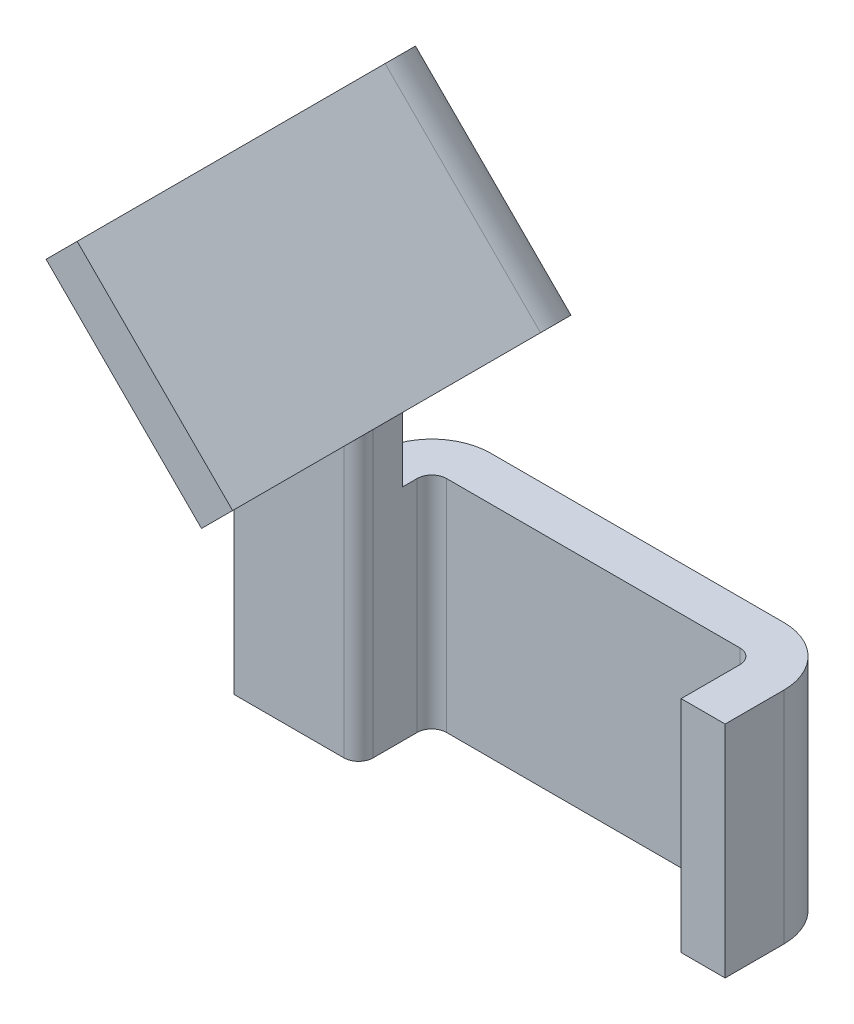
ISO-10303-21;
HEADER;
FILE_DESCRIPTION(('STEP AP214'),'2;1');
FILE_NAME('part.step','',(''),(''),'','','');
FILE_SCHEMA(('AUTOMOTIVE_DESIGN { 1 0 10303 214 1 1 1 1 }'));
ENDSEC;
DATA;
#1=APPLICATION_CONTEXT('core data for automotive mechanical design processes');
#2=APPLICATION_PROTOCOL_DEFINITION('international standard','automotive_design',2000,#1);
#3=PRODUCT_CONTEXT('',#1,'mechanical');
#4=PRODUCT('Part','Part','',(#3));
#5=PRODUCT_RELATED_PRODUCT_CATEGORY('part','',(#4));
#6=PRODUCT_DEFINITION_FORMATION('','',#4);
#7=PRODUCT_DEFINITION_CONTEXT('part definition',#1,'design');
#8=PRODUCT_DEFINITION('design','',#6,#7);
#9=PRODUCT_DEFINITION_SHAPE('','',#8);
#10=(LENGTH_UNIT() NAMED_UNIT(*) SI_UNIT(.MILLI.,.METRE.));
#11=(NAMED_UNIT(*) PLANE_ANGLE_UNIT() SI_UNIT($,.RADIAN.));
#12=(NAMED_UNIT(*) SI_UNIT($,.STERADIAN.) SOLID_ANGLE_UNIT());
#13=UNCERTAINTY_MEASURE_WITH_UNIT(LENGTH_MEASURE(1.E-05),#10,'distance_accuracy_value','');
#14=(GEOMETRIC_REPRESENTATION_CONTEXT(3) GLOBAL_UNCERTAINTY_ASSIGNED_CONTEXT((#13)) GLOBAL_UNIT_ASSIGNED_CONTEXT((#10,
#11,#12)) REPRESENTATION_CONTEXT('',''));
#15=CARTESIAN_POINT('',(0.,0.,0.));
#16=DIRECTION('',(0.,0.,1.));
#17=DIRECTION('',(1.,0.,0.));
#18=AXIS2_PLACEMENT_3D('',#15,#16,#17);
#19=CARTESIAN_POINT('',(-6.199999999999,13.5,2.));
#20=DIRECTION('',(0.,0.,-1.));
#21=DIRECTION('',(0.,-1.,0.));
#22=AXIS2_PLACEMENT_3D('',#19,#20,#21);
#23=PLANE('',#22);
#24=DIRECTION('',(1.,0.,0.));
#25=VECTOR('',#24,1.);
#26=CARTESIAN_POINT('',(-8.600000000009,12.00000000001,2.00000000001));
#27=LINE('',#26,#25);
#28=CARTESIAN_POINT('',(-8.599999999999,12.,2.));
#29=VERTEX_POINT('',#28);
#30=CARTESIAN_POINT('',(-6.599999999999,12.,2.));
#31=VERTEX_POINT('',#30);
#32=EDGE_CURVE('E258',#29,#31,#27,.T.);
#33=ORIENTED_EDGE('',*,*,#32,.T.);
#34=DIRECTION('',(0.,-1.,0.));
#35=VECTOR('',#34,1.);
#36=CARTESIAN_POINT('',(-6.600000000009,13.50000000001,2.00000000001));
#37=LINE('',#36,#35);
#38=CARTESIAN_POINT('',(-6.599999999999,13.5,2.));
#39=VERTEX_POINT('',#38);
#40=EDGE_CURVE('E784',#39,#31,#37,.T.);
#41=ORIENTED_EDGE('',*,*,#40,.F.);
#42=DIRECTION('',(-1.,0.,0.));
#43=VECTOR('',#42,1.);
#44=CARTESIAN_POINT('',(-6.600000000009,13.50000000001,2.00000000001));
#45=LINE('',#44,#43);
#46=CARTESIAN_POINT('',(-8.599999999999,13.5,2.));
#47=VERTEX_POINT('',#46);
#48=EDGE_CURVE('E827',#39,#47,#45,.T.);
#49=ORIENTED_EDGE('',*,*,#48,.T.);
#50=DIRECTION('',(0.,1.,0.));
#51=VECTOR('',#50,1.);
#52=CARTESIAN_POINT('',(-8.600000000009,12.00000000001,2.00000000001));
#53=LINE('',#52,#51);
#54=EDGE_CURVE('E11',#29,#47,#53,.T.);
#55=ORIENTED_EDGE('',*,*,#54,.F.);
#56=EDGE_LOOP('',(#33,#41,#49,#55));
#57=FACE_BOUND('',#56,.T.);
#58=ADVANCED_FACE('F17',(#57),#23,.F.);
#59=CARTESIAN_POINT('',(-8.599999999999,13.5,2.1));
#60=DIRECTION('',(0.,1.,0.));
#61=DIRECTION('',(0.,0.,1.));
#62=AXIS2_PLACEMENT_3D('',#59,#60,#61);
#63=CYLINDRICAL_SURFACE('',#62,0.1);
#64=ORIENTED_EDGE('',*,*,#54,.T.);
#65=CARTESIAN_POINT('',(-8.600000000009,13.50000000001,2.10000000001));
#66=DIRECTION('',(0.,-1.,0.));
#67=DIRECTION('',(-1.,0.,0.));
#68=AXIS2_PLACEMENT_3D('',#65,#66,#67);
#69=CIRCLE('',#68,0.10000000001);
#70=CARTESIAN_POINT('',(-8.699999999999,13.5,2.1));
#71=VERTEX_POINT('',#70);
#72=EDGE_CURVE('E830',#71,#47,#69,.T.);
#73=ORIENTED_EDGE('',*,*,#72,.F.);
#74=DIRECTION('',(0.,-1.,0.));
#75=VECTOR('',#74,1.);
#76=CARTESIAN_POINT('',(-8.700000000009,13.50000000001,2.10000000001));
#77=LINE('',#76,#75);
#78=CARTESIAN_POINT('',(-8.699999999999,12.,2.1));
#79=VERTEX_POINT('',#78);
#80=EDGE_CURVE('E386',#71,#79,#77,.T.);
#81=ORIENTED_EDGE('',*,*,#80,.T.);
#82=CARTESIAN_POINT('',(-8.600000000009,12.00000000001,2.10000000001));
#83=DIRECTION('',(0.,1.,0.));
#84=DIRECTION('',(0.,0.,-1.));
#85=AXIS2_PLACEMENT_3D('',#82,#83,#84);
#86=CIRCLE('',#85,0.10000000001);
#87=EDGE_CURVE('E261',#29,#79,#86,.T.);
#88=ORIENTED_EDGE('',*,*,#87,.F.);
#89=EDGE_LOOP('',(#64,#73,#81,#88));
#90=FACE_BOUND('',#89,.T.);
#91=ADVANCED_FACE('F677',(#90),#63,.F.);
#92=CARTESIAN_POINT('',(-8.701471862575,16.05852813742,2.6));
#93=DIRECTION('',(-0.707106781186548,0.707106781186548,0.));
#94=DIRECTION('',(0.707106781186548,0.707106781186548,0.));
#95=AXIS2_PLACEMENT_3D('',#92,#93,#94);
#96=CYLINDRICAL_SURFACE('',#95,0.4);
#97=DIRECTION('',(0.707106781186548,-0.707106781186548,0.));
#98=VECTOR('',#97,1.);
#99=CARTESIAN_POINT('',(-8.701471862585,16.05852813743,2.20000000001));
#100=LINE('',#99,#98);
#101=CARTESIAN_POINT('',(-8.701471862575,16.05852813742,2.2));
#102=VERTEX_POINT('',#101);
#103=CARTESIAN_POINT('',(-7.641471862576,14.99852813742,2.2));
#104=VERTEX_POINT('',#103);
#105=EDGE_CURVE('E826',#102,#104,#100,.T.);
#106=ORIENTED_EDGE('',*,*,#105,.F.);
#107=CARTESIAN_POINT('',(-8.701471862585,16.05852813743,2.60000000001));
#108=DIRECTION('',(-0.707106781186548,0.707106781186548,0.));
#109=DIRECTION('',(0.707106781186548,0.707106781186548,-4.71511697856544E-11));
#110=AXIS2_PLACEMENT_3D('',#107,#108,#109);
#111=CIRCLE('',#110,0.400000000014142);
#112=CARTESIAN_POINT('',(-8.418629150101,16.3413708499,2.599999999997));
#113=VERTEX_POINT('',#112);
#114=EDGE_CURVE('E327',#113,#102,#111,.T.);
#115=ORIENTED_EDGE('',*,*,#114,.F.);
#116=DIRECTION('',(0.707106781186598,-0.707106781186498,7.43364663020343E-12));
#117=VECTOR('',#116,1.);
#118=CARTESIAN_POINT('',(-8.418629150111,16.34137084991,2.600000000007));
#119=LINE('',#118,#117);
#120=CARTESIAN_POINT('',(-7.358629150101,15.2813708499,2.599999999998));
#121=VERTEX_POINT('',#120);
#122=EDGE_CURVE('E26',#113,#121,#119,.T.);
#123=ORIENTED_EDGE('',*,*,#122,.T.);
#124=CARTESIAN_POINT('',(-7.641471862586,14.99852813743,2.60000000001));
#125=DIRECTION('',(0.707106781186548,-0.707106781186548,0.));
#126=DIRECTION('',(-2.50244249059162E-11,-2.5022204459867E-11,-1.));
#127=AXIS2_PLACEMENT_3D('',#124,#125,#126);
#128=CIRCLE('',#127,0.40000000001);
#129=EDGE_CURVE('E301',#104,#121,#128,.T.);
#130=ORIENTED_EDGE('',*,*,#129,.F.);
#131=EDGE_LOOP('',(#106,#115,#123,#130));
#132=FACE_BOUND('',#131,.T.);
#133=ADVANCED_FACE('F666',(#132),#96,.T.);
#134=CARTESIAN_POINT('',(-8.418629150101,16.3413708499,4.7));
#135=DIRECTION('',(0.707106781186548,0.707106781186548,0.));
#136=DIRECTION('',(0.,0.,-1.));
#137=AXIS2_PLACEMENT_3D('',#134,#135,#136);
#138=PLANE('',#137);
#139=DIRECTION('',(-0.707106781186598,0.707106781186498,0.));
#140=VECTOR('',#139,1.);
#141=CARTESIAN_POINT('',(-7.358629150111,15.28137084991,4.70000000001));
#142=LINE('',#141,#140);
#143=CARTESIAN_POINT('',(-7.358629150101,15.2813708499,4.7));
#144=VERTEX_POINT('',#143);
#145=CARTESIAN_POINT('',(-8.418629150101,16.3413708499,4.7));
#146=VERTEX_POINT('',#145);
#147=EDGE_CURVE('E337',#144,#146,#142,.T.);
#148=ORIENTED_EDGE('',*,*,#147,.F.);
#149=DIRECTION('',(4.8566437933117E-12,4.86256498277637E-12,-1.));
#150=VECTOR('',#149,1.);
#151=CARTESIAN_POINT('',(-7.358629150111,15.28137084991,4.70000000001));
#152=LINE('',#151,#150);
#153=EDGE_CURVE('E305',#144,#121,#152,.T.);
#154=ORIENTED_EDGE('',*,*,#153,.T.);
#155=ORIENTED_EDGE('',*,*,#122,.F.);
#156=DIRECTION('',(4.86087321435554E-12,4.86002733014631E-12,-1.));
#157=VECTOR('',#156,1.);
#158=CARTESIAN_POINT('',(-8.418629150111,16.34137084991,4.70000000001));
#159=LINE('',#158,#157);
#160=EDGE_CURVE('E323',#146,#113,#159,.T.);
#161=ORIENTED_EDGE('',*,*,#160,.F.);
#162=EDGE_LOOP('',(#148,#154,#155,#161));
#163=FACE_BOUND('',#162,.T.);
#164=ADVANCED_FACE('F655',(#163),#138,.T.);
#165=CARTESIAN_POINT('',(-7.570761184456,15.06923881554,4.7));
#166=DIRECTION('',(0.,0.,-1.));
#167=DIRECTION('',(0.,-1.,0.));
#168=AXIS2_PLACEMENT_3D('',#165,#166,#167);
#169=PLANE('',#168);
#170=ORIENTED_EDGE('',*,*,#147,.T.);
#171=DIRECTION('',(-0.707106781186498,-0.707106781186598,0.));
#172=VECTOR('',#171,1.);
#173=CARTESIAN_POINT('',(-8.418629150111,16.34137084991,4.70000000001));
#174=LINE('',#173,#172);
#175=CARTESIAN_POINT('',(-8.630761184457,16.12923881554,4.7));
#176=VERTEX_POINT('',#175);
#177=EDGE_CURVE('E281',#146,#176,#174,.T.);
#178=ORIENTED_EDGE('',*,*,#177,.T.);
#179=DIRECTION('',(0.707106781186698,-0.707106781186398,0.));
#180=VECTOR('',#179,1.);
#181=CARTESIAN_POINT('',(-8.630761184467,16.12923881555,4.70000000001));
#182=LINE('',#181,#180);
#183=CARTESIAN_POINT('',(-7.570761184457,15.06923881554,4.7));
#184=VERTEX_POINT('',#183);
#185=EDGE_CURVE('E340',#176,#184,#182,.T.);
#186=ORIENTED_EDGE('',*,*,#185,.T.);
#187=DIRECTION('',(0.707106781186248,0.707106781186848,0.));
#188=VECTOR('',#187,1.);
#189=CARTESIAN_POINT('',(-7.570761184467,15.06923881555,4.70000000001));
#190=LINE('',#189,#188);
#191=EDGE_CURVE('E307',#184,#144,#190,.T.);
#192=ORIENTED_EDGE('',*,*,#191,.T.);
#193=EDGE_LOOP('',(#170,#178,#186,#192));
#194=FACE_BOUND('',#193,.T.);
#195=ADVANCED_FACE('F645',(#194),#169,.F.);
#196=CARTESIAN_POINT('',(-8.701471862575,16.05852813742,2.6));
#197=DIRECTION('',(-0.707106781186548,0.707106781186548,0.));
#198=DIRECTION('',(0.707106781186548,0.707106781186548,0.));
#199=AXIS2_PLACEMENT_3D('',#196,#197,#198);
#200=CYLINDRICAL_SURFACE('',#199,0.1);
#201=DIRECTION('',(-0.707106781186548,0.707106781186548,0.));
#202=VECTOR('',#201,1.);
#203=CARTESIAN_POINT('',(-7.641471862585,14.99852813743,2.50000000001));
#204=LINE('',#203,#202);
#205=CARTESIAN_POINT('',(-7.641471862575,14.99852813742,2.5));
#206=VERTEX_POINT('',#205);
#207=CARTESIAN_POINT('',(-8.701471862575,16.05852813742,2.5));
#208=VERTEX_POINT('',#207);
#209=EDGE_CURVE('E282',#206,#208,#204,.T.);
#210=ORIENTED_EDGE('',*,*,#209,.F.);
#211=CARTESIAN_POINT('',(-7.641471862585,14.99852813743,2.60000000001));
#212=DIRECTION('',(-0.707106781186548,0.707106781186548,0.));
#213=DIRECTION('',(0.707106781186548,0.707106781186548,1.37019276513725E-10));
#214=AXIS2_PLACEMENT_3D('',#211,#212,#213);
#215=CIRCLE('',#214,0.100000000014142);
#216=CARTESIAN_POINT('',(-7.570761184457,15.06923881554,2.600000000001));
#217=VERTEX_POINT('',#216);
#218=EDGE_CURVE('E315',#217,#206,#215,.T.);
#219=ORIENTED_EDGE('',*,*,#218,.F.);
#220=DIRECTION('',(-0.707106781186698,0.707106781186398,-7.8599415449251E-12));
#221=VECTOR('',#220,1.);
#222=CARTESIAN_POINT('',(-7.570761184467,15.06923881555,2.600000000011));
#223=LINE('',#222,#221);
#224=CARTESIAN_POINT('',(-8.630761184457,16.12923881554,2.599999999999));
#225=VERTEX_POINT('',#224);
#226=EDGE_CURVE('E39',#217,#225,#223,.T.);
#227=ORIENTED_EDGE('',*,*,#226,.T.);
#228=CARTESIAN_POINT('',(-8.701471862585,16.05852813743,2.60000000001));
#229=DIRECTION('',(0.707106781186548,-0.707106781186548,0.));
#230=DIRECTION('',(0.,0.,-1.));
#231=AXIS2_PLACEMENT_3D('',#228,#229,#230);
#232=CIRCLE('',#231,0.10000000001);
#233=EDGE_CURVE('E330',#208,#225,#232,.T.);
#234=ORIENTED_EDGE('',*,*,#233,.F.);
#235=EDGE_LOOP('',(#210,#219,#227,#234));
#236=FACE_BOUND('',#235,.T.);
#237=ADVANCED_FACE('F634',(#236),#200,.F.);
#238=CARTESIAN_POINT('',(-7.586990009292,15.08546764038,4.7));
#239=DIRECTION('',(0.707106781186548,0.707106781186548,0.));
#240=DIRECTION('',(0.,0.,-1.));
#241=AXIS2_PLACEMENT_3D('',#238,#239,#240);
#242=PLANE('',#241);
#243=DIRECTION('',(-4.78855011447525E-12,-4.78389775132446E-12,1.));
#244=VECTOR('',#243,1.);
#245=CARTESIAN_POINT('',(-7.570761184467,15.06923881555,2.600000000011));
#246=LINE('',#245,#244);
#247=EDGE_CURVE('E311',#217,#184,#246,.T.);
#248=ORIENTED_EDGE('',*,*,#247,.T.);
#249=ORIENTED_EDGE('',*,*,#185,.F.);
#250=DIRECTION('',(4.78728128815684E-12,4.78728128815684E-12,-1.));
#251=VECTOR('',#250,1.);
#252=CARTESIAN_POINT('',(-8.630761184467,16.12923881555,4.70000000001));
#253=LINE('',#252,#251);
#254=EDGE_CURVE('E334',#176,#225,#253,.T.);
#255=ORIENTED_EDGE('',*,*,#254,.T.);
#256=ORIENTED_EDGE('',*,*,#226,.F.);
#257=EDGE_LOOP('',(#248,#249,#255,#256));
#258=FACE_BOUND('',#257,.T.);
#259=ADVANCED_FACE('F623',(#258),#242,.F.);
#260=CARTESIAN_POINT('',(-9.549999999999,15.21,2.2));
#261=DIRECTION('',(-0.707106781186548,0.707106781186548,0.));
#262=DIRECTION('',(0.,0.,1.));
#263=AXIS2_PLACEMENT_3D('',#260,#261,#262);
#264=PLANE('',#263);
#265=ORIENTED_EDGE('',*,*,#177,.F.);
#266=ORIENTED_EDGE('',*,*,#160,.T.);
#267=ORIENTED_EDGE('',*,*,#114,.T.);
#268=DIRECTION('',(0.707106781186548,0.707106781186548,0.));
#269=VECTOR('',#268,1.);
#270=CARTESIAN_POINT('',(-9.550000000009,15.21000000001,2.20000000001));
#271=LINE('',#270,#269);
#272=CARTESIAN_POINT('',(-9.549999999999,15.21,2.2));
#273=VERTEX_POINT('',#272);
#274=EDGE_CURVE('E294',#273,#102,#271,.T.);
#275=ORIENTED_EDGE('',*,*,#274,.F.);
#276=DIRECTION('',(0.,0.,-1.));
#277=VECTOR('',#276,1.);
#278=CARTESIAN_POINT('',(-9.550000000009,15.21000000001,2.50000000001));
#279=LINE('',#278,#277);
#280=CARTESIAN_POINT('',(-9.549999999999,15.21,2.5));
#281=VERTEX_POINT('',#280);
#282=EDGE_CURVE('E286',#281,#273,#279,.T.);
#283=ORIENTED_EDGE('',*,*,#282,.F.);
#284=DIRECTION('',(-0.707106781186548,-0.707106781186548,0.));
#285=VECTOR('',#284,1.);
#286=CARTESIAN_POINT('',(-8.701471862585,16.05852813743,2.50000000001));
#287=LINE('',#286,#285);
#288=EDGE_CURVE('E278',#208,#281,#287,.T.);
#289=ORIENTED_EDGE('',*,*,#288,.F.);
#290=ORIENTED_EDGE('',*,*,#233,.T.);
#291=ORIENTED_EDGE('',*,*,#254,.F.);
#292=EDGE_LOOP('',(#265,#266,#267,#275,#283,#289,#290,#291));
#293=FACE_BOUND('',#292,.T.);
#294=ADVANCED_FACE('F613',(#293),#264,.T.);
#295=CARTESIAN_POINT('',(-8.630761184456,16.12923881554,2.5));
#296=DIRECTION('',(0.,0.,-1.));
#297=DIRECTION('',(0.,-1.,0.));
#298=AXIS2_PLACEMENT_3D('',#295,#296,#297);
#299=PLANE('',#298);
#300=DIRECTION('',(0.707106781186548,0.707106781186548,0.));
#301=VECTOR('',#300,1.);
#302=CARTESIAN_POINT('',(-8.800000000009,13.84000000001,2.50000000001));
#303=LINE('',#302,#301);
#304=CARTESIAN_POINT('',(-8.799999999999,13.84,2.5));
#305=VERTEX_POINT('',#304);
#306=EDGE_CURVE('E319',#305,#206,#303,.T.);
#307=ORIENTED_EDGE('',*,*,#306,.T.);
#308=ORIENTED_EDGE('',*,*,#209,.T.);
#309=ORIENTED_EDGE('',*,*,#288,.T.);
#310=DIRECTION('',(0.,-1.,0.));
#311=VECTOR('',#310,1.);
#312=CARTESIAN_POINT('',(-9.550000000009,15.21000000001,2.50000000001));
#313=LINE('',#312,#311);
#314=CARTESIAN_POINT('',(-9.549999999999,12.,2.5));
#315=VERTEX_POINT('',#314);
#316=EDGE_CURVE('E283',#281,#315,#313,.T.);
#317=ORIENTED_EDGE('',*,*,#316,.T.);
#318=DIRECTION('',(1.,0.,0.));
#319=VECTOR('',#318,1.);
#320=CARTESIAN_POINT('',(-9.550000000009,12.00000000001,2.50000000001));
#321=LINE('',#320,#319);
#322=CARTESIAN_POINT('',(-8.799999999999,12.,2.5));
#323=VERTEX_POINT('',#322);
#324=EDGE_CURVE('E273',#315,#323,#321,.T.);
#325=ORIENTED_EDGE('',*,*,#324,.T.);
#326=DIRECTION('',(0.,-1.,0.));
#327=VECTOR('',#326,1.);
#328=CARTESIAN_POINT('',(-8.800000000009,13.84000000001,2.50000000001));
#329=LINE('',#328,#327);
#330=EDGE_CURVE('E394',#305,#323,#329,.T.);
#331=ORIENTED_EDGE('',*,*,#330,.F.);
#332=EDGE_LOOP('',(#307,#308,#309,#317,#325,#331));
#333=FACE_BOUND('',#332,.T.);
#334=ADVANCED_FACE('F367',(#333),#299,.F.);
#335=CARTESIAN_POINT('',(-8.799999999999,16.12923881554,2.4));
#336=DIRECTION('',(0.,1.,0.));
#337=DIRECTION('',(0.,0.,1.));
#338=AXIS2_PLACEMENT_3D('',#335,#336,#337);
#339=CYLINDRICAL_SURFACE('',#338,0.1);
#340=ORIENTED_EDGE('',*,*,#330,.T.);
#341=CARTESIAN_POINT('',(-8.800000000009,12.00000000001,2.40000000001));
#342=DIRECTION('',(0.,-1.,0.));
#343=DIRECTION('',(1.,0.,0.));
#344=AXIS2_PLACEMENT_3D('',#341,#342,#343);
#345=CIRCLE('',#344,0.10000000001);
#346=CARTESIAN_POINT('',(-8.699999999999,12.,2.4));
#347=VERTEX_POINT('',#346);
#348=EDGE_CURVE('E269',#347,#323,#345,.T.);
#349=ORIENTED_EDGE('',*,*,#348,.F.);
#350=DIRECTION('',(0.,1.,0.));
#351=VECTOR('',#350,1.);
#352=CARTESIAN_POINT('',(-8.700000000009,12.00000000001,2.40000000001));
#353=LINE('',#352,#351);
#354=CARTESIAN_POINT('',(-8.699999999999,13.94,2.4));
#355=VERTEX_POINT('',#354);
#356=EDGE_CURVE('E389',#347,#355,#353,.T.);
#357=ORIENTED_EDGE('',*,*,#356,.T.);
#358=CARTESIAN_POINT('',(-8.699999999999,13.94,2.40000000001));
#359=CARTESIAN_POINT('',(-8.69999998876609,13.9400000080791,2.40085035187704));
#360=CARTESIAN_POINT('',(-8.70001084605066,13.93998989779,2.40170070093458));
#361=CARTESIAN_POINT('',(-8.70005423811178,13.9399495042972,2.40340120354723));
#362=CARTESIAN_POINT('',(-8.7000867941837,13.9399192012762,2.40425135608876));
#363=CARTESIAN_POINT('',(-8.70017359092352,13.9398384241546,2.40595091059614));
#364=CARTESIAN_POINT('',(-8.70022786497825,13.9397879189975,2.40680030937899));
#365=CARTESIAN_POINT('',(-8.70035807401523,13.9396667513372,2.40849780412215));
#366=CARTESIAN_POINT('',(-8.70043405421916,13.9395960467514,2.4093458936068));
#367=CARTESIAN_POINT('',(-8.70060764242992,13.9394344905115,2.41104021768655));
#368=CARTESIAN_POINT('',(-8.70070530716554,13.9393435860119,2.41188644142584));
#369=CARTESIAN_POINT('',(-8.7009222162274,13.9391416407973,2.41357648324759));
#370=CARTESIAN_POINT('',(-8.7010415283569,13.9390305368117,2.41442028506031));
#371=CARTESIAN_POINT('',(-8.70130167051262,13.9387882028865,2.41610493365628));
#372=CARTESIAN_POINT('',(-8.70144257890065,13.9386568996473,2.41694575778503));
#373=CARTESIAN_POINT('',(-8.70174583806239,13.9383741771222,2.41862390339271));
#374=CARTESIAN_POINT('',(-8.70190827716039,13.9382226749594,2.41946119493499));
#375=CARTESIAN_POINT('',(-8.70225450860188,13.9378995640074,2.42113172977753));
#376=CARTESIAN_POINT('',(-8.70243839856659,13.9377278632635,2.42196493504303));
#377=CARTESIAN_POINT('',(-8.70282742901952,13.9373643640587,2.42362675405652));
#378=CARTESIAN_POINT('',(-8.70303267570021,13.9371724651056,2.4244553209437));
#379=CARTESIAN_POINT('',(-8.70346430336605,13.9367685778369,2.42610732251938));
#380=CARTESIAN_POINT('',(-8.70369079833944,13.9365564810648,2.42693070088583));
#381=CARTESIAN_POINT('',(-8.70416479294827,13.9361122059288,2.42857178760819));
#382=CARTESIAN_POINT('',(-8.70441241355278,13.9358799117428,2.42938942964135));
#383=CARTESIAN_POINT('',(-8.70492851643381,13.9353952489423,2.43101850902697));
#384=CARTESIAN_POINT('',(-8.70519712581628,13.9351427577569,2.43182986961357));
#385=CARTESIAN_POINT('',(-8.70575504998886,13.9346177074989,2.43344585484766));
#386=CARTESIAN_POINT('',(-8.70604449715894,13.9343450197338,2.43425039194054));
#387=CARTESIAN_POINT('',(-8.70664392744455,13.9337795822253,2.43585220261553));
#388=CARTESIAN_POINT('',(-8.70695404734191,13.9334866982989,2.43664937760373));
#389=CARTESIAN_POINT('',(-8.70759464048594,13.9328808737516,2.43823594044291));
#390=CARTESIAN_POINT('',(-8.70792525404389,13.9325677940854,2.43902521850203));
#391=CARTESIAN_POINT('',(-8.70860663889152,13.931921582688,2.44059546812988));
#392=CARTESIAN_POINT('',(-8.70895755315802,13.9315883076683,2.44137631863848));
#393=CARTESIAN_POINT('',(-8.70967933071646,13.9309017096822,2.44292919816271));
#394=CARTESIAN_POINT('',(-8.71005033880134,13.930548239791,2.44370109486078));
#395=CARTESIAN_POINT('',(-8.71081208282193,13.9298212551797,2.44523555715212));
#396=CARTESIAN_POINT('',(-8.71120296454431,13.9294475904821,2.44599797926489));
#397=CARTESIAN_POINT('',(-8.71200422022963,13.9286802203065,2.44751298558297));
#398=CARTESIAN_POINT('',(-8.71241474016024,13.9282863623766,2.44826541528428));
#399=CARTESIAN_POINT('',(-8.71325503005303,13.9274786035107,2.44975994392325));
#400=CARTESIAN_POINT('',(-8.71368494545618,13.9270645481341,2.45050187763789));
#401=CARTESIAN_POINT('',(-8.71456374824253,13.9262164132572,2.45197489463729));
#402=CARTESIAN_POINT('',(-8.71501277958803,13.9257821780474,2.45270580194832));
#403=CARTESIAN_POINT('',(-8.71639491666316,13.9244426641871,2.45489256186385));
#404=CARTESIAN_POINT('',(-8.71735020449952,13.923512926611,2.45631962276804));
#405=CARTESIAN_POINT('',(-8.71933268110094,13.9215739782956,2.45912526215527));
#406=CARTESIAN_POINT('',(-8.72036095777235,13.920563509564,2.46050219566578));
#407=CARTESIAN_POINT('',(-8.72248705659681,13.9184631257047,2.46320412893764));
#408=CARTESIAN_POINT('',(-8.72358590473331,13.9173719609068,2.46452734862763));
#409=CARTESIAN_POINT('',(-8.72585020187128,13.9151098000982,2.46711806732335));
#410=CARTESIAN_POINT('',(-8.72701659097949,13.9139375640737,2.46838365685477));
#411=CARTESIAN_POINT('',(-8.7294140546298,13.9115147530393,2.47085657382795));
#412=CARTESIAN_POINT('',(-8.73064599871535,13.9102629989891,2.47206190427568));
#413=CARTESIAN_POINT('',(-8.73264892382237,13.9082077978129,2.47392497100223));
#414=CARTESIAN_POINT('',(-8.73341074848007,13.9074215428969,2.47461171635991));
#415=CARTESIAN_POINT('',(-8.73500914832061,13.9057631718888,2.47600927818011));
#416=CARTESIAN_POINT('',(-8.73584657972241,13.9048894325224,2.47671719014262));
#417=CARTESIAN_POINT('',(-8.73760021110494,13.9030567835677,2.47815143958424));
#418=CARTESIAN_POINT('',(-8.73851743285575,13.9020965734045,2.47887485919824));
#419=CARTESIAN_POINT('',(-8.74043391475404,13.9000904807822,2.48033327807063));
#420=CARTESIAN_POINT('',(-8.74143427516796,13.8990434619009,2.48106526634041));
#421=CARTESIAN_POINT('',(-8.74352032986485,13.8968636707205,2.48253352383083));
#422=CARTESIAN_POINT('',(-8.74460719091552,13.8957299200702,2.4832666801988));
#423=CARTESIAN_POINT('',(-8.74686921984891,13.8933765025423,2.48472926482289));
#424=CARTESIAN_POINT('',(-8.74804558923027,13.8921559789529,2.48545545463022));
#425=CARTESIAN_POINT('',(-8.75048926601655,13.8896289111042,2.48689544110736));
#426=CARTESIAN_POINT('',(-8.75175778389072,13.8883216125764,2.48760585841405));
#427=CARTESIAN_POINT('',(-8.75438791991249,13.8856208994714,2.48900495060476));
#428=CARTESIAN_POINT('',(-8.75575073005147,13.8842268155163,2.4896900913986));
#429=CARTESIAN_POINT('',(-8.75857103951353,13.8813524541756,2.4910286058246));
#430=CARTESIAN_POINT('',(-8.7600296849604,13.8798715790744,2.49167828002048));
#431=CARTESIAN_POINT('',(-8.76304256075317,13.8768235692025,2.49293517356435));
#432=CARTESIAN_POINT('',(-8.76459786326946,13.8752558975605,2.49353852014768));
#433=CARTESIAN_POINT('',(-8.76780413252077,13.8720342383691,2.49469143597962));
#434=CARTESIAN_POINT('',(-8.76945606873088,13.870379766071,2.4952369539566));
#435=CARTESIAN_POINT('',(-8.7728547394216,13.8669844569722,2.49626229836656));
#436=CARTESIAN_POINT('',(-8.77460231119651,13.8652431803727,2.49673789272237));
#437=CARTESIAN_POINT('',(-8.7781903095631,13.861674221393,2.49761094257244));
#438=CARTESIAN_POINT('',(-8.78003141107181,13.8598461382818,2.4980039858404));
#439=CARTESIAN_POINT('',(-8.78380331375894,13.856103527275,2.49869903719401));
#440=CARTESIAN_POINT('',(-8.78573459665057,13.8541886326456,2.4989964569899));
#441=CARTESIAN_POINT('',(-8.78968236125348,13.8502723765522,2.49948699402807));
#442=CARTESIAN_POINT('',(-8.79169910016302,13.8482706787296,2.49967535349437));
#443=CARTESIAN_POINT('',(-8.79581179897967,13.8441807487204,2.4999343377629));
#444=CARTESIAN_POINT('',(-8.79790775998464,13.8420922050628,2.50000004893194));
#445=CARTESIAN_POINT('',(-8.799999999999,13.84,2.5));
#446=B_SPLINE_CURVE_WITH_KNOTS('',3,(#358,#359,#360,#361,#362,#363,#364,#365,#366,#367,#368,
#369,#370,#371,#372,#373,#374,#375,#376,#377,#378,#379,#380,#381,#382,#383,#384,#385,#386,#387,
#388,#389,#390,#391,#392,#393,#394,#395,#396,#397,#398,#399,#400,#401,#402,#403,#404,#405,#406,
#407,#408,#409,#410,#411,#412,#413,#414,#415,#416,#417,#418,#419,#420,#421,#422,#423,#424,#425,
#426,#427,#428,#429,#430,#431,#432,#433,#434,#435,#436,#437,#438,#439,#440,#441,#442,#443,#444,
#445),.UNSPECIFIED.,.F.,.F.,(4,2,2,2,2,2,2,2,2,2,2,2,2,2,2,2,2,2,2,2,2,2,2,2,2,2,2,2,2,2,2,2,2,
2,2,2,2,2,2,2,2,2,2,4),(0.,0.0025509218839094,0.00510435095837597,0.00766172056651,
0.0102244574395878,0.0127939793683547,0.015371692947856,0.0179589914129021,0.0205572525795787,
0.0231678369063231,0.0257920856859883,0.0284313193781524,0.0310868360886782,0.0337599102013157,
0.0364517911639847,0.0391637024303133,0.0418968405551543,0.0446523744410297,0.0474314447310214,
0.050235163342251,0.0530646131331009,0.0559208476964145,0.0588048912703132,0.0646597427251296,
0.0706374114367157,0.0767450482920248,0.0829893576814172,0.0893766136343092,0.0932531453666222,
0.0974587137551435,0.101994507139104,0.106861471291333,0.112060370568593,0.117591831046937,
0.123456371618716,0.1296544268486,0.136186364065214,0.143052496341833,0.150253092493714,
0.157788384875875,0.165658575535739,0.173863841119061,0.182404336819694,0.191280199587869),.UNSPECIFIED.);
#447=EDGE_CURVE('E349',#355,#305,#446,.T.);
#448=ORIENTED_EDGE('',*,*,#447,.T.);
#449=EDGE_LOOP('',(#340,#349,#357,#448));
#450=FACE_BOUND('',#449,.T.);
#451=ADVANCED_FACE('F356',(#450),#339,.T.);
#452=CARTESIAN_POINT('',(-8.699999999999,13.94,2.2));
#453=DIRECTION('',(0.707106781186548,-0.707106781186548,0.));
#454=DIRECTION('',(0.,0.,-1.));
#455=AXIS2_PLACEMENT_3D('',#452,#453,#454);
#456=PLANE('',#455);
#457=DIRECTION('',(0.,0.,1.));
#458=VECTOR('',#457,1.);
#459=CARTESIAN_POINT('',(-8.700000000009,13.94000000001,2.20000000001));
#460=LINE('',#459,#458);
#461=CARTESIAN_POINT('',(-8.699999999999,13.94,2.2));
#462=VERTEX_POINT('',#461);
#463=EDGE_CURVE('E306',#462,#355,#460,.T.);
#464=ORIENTED_EDGE('',*,*,#463,.F.);
#465=DIRECTION('',(-0.707106781186498,-0.707106781186597,0.));
#466=VECTOR('',#465,1.);
#467=CARTESIAN_POINT('',(-7.641471862585,14.99852813743,2.20000000001));
#468=LINE('',#467,#466);
#469=EDGE_CURVE('E822',#104,#462,#468,.T.);
#470=ORIENTED_EDGE('',*,*,#469,.F.);
#471=ORIENTED_EDGE('',*,*,#129,.T.);
#472=ORIENTED_EDGE('',*,*,#153,.F.);
#473=ORIENTED_EDGE('',*,*,#191,.F.);
#474=ORIENTED_EDGE('',*,*,#247,.F.);
#475=ORIENTED_EDGE('',*,*,#218,.T.);
#476=ORIENTED_EDGE('',*,*,#306,.F.);
#477=ORIENTED_EDGE('',*,*,#447,.F.);
#478=EDGE_LOOP('',(#464,#470,#471,#472,#473,#474,#475,#476,#477));
#479=FACE_BOUND('',#478,.T.);
#480=ADVANCED_FACE('F366',(#479),#456,.T.);
#481=CARTESIAN_POINT('',(-8.699999999999,12.,2.2));
#482=DIRECTION('',(1.,0.,0.));
#483=DIRECTION('',(0.,1.,0.));
#484=AXIS2_PLACEMENT_3D('',#481,#482,#483);
#485=PLANE('',#484);
#486=ORIENTED_EDGE('',*,*,#356,.F.);
#487=DIRECTION('',(0.,-3.33451757111511E-11,-1.));
#488=VECTOR('',#487,1.);
#489=CARTESIAN_POINT('',(-8.700000000009,12.00000000001,2.40000000001));
#490=LINE('',#489,#488);
#491=EDGE_CURVE('E265',#347,#79,#490,.T.);
#492=ORIENTED_EDGE('',*,*,#491,.T.);
#493=ORIENTED_EDGE('',*,*,#80,.F.);
#494=DIRECTION('',(0.,0.,1.));
#495=VECTOR('',#494,1.);
#496=CARTESIAN_POINT('',(-8.700000000009,13.50000000001,2.10000000001));
#497=LINE('',#496,#495);
#498=CARTESIAN_POINT('',(-8.699999999999,13.5,2.2));
#499=VERTEX_POINT('',#498);
#500=EDGE_CURVE('E831',#71,#499,#497,.T.);
#501=ORIENTED_EDGE('',*,*,#500,.T.);
#502=DIRECTION('',(0.,-1.,0.));
#503=VECTOR('',#502,1.);
#504=CARTESIAN_POINT('',(-8.700000000009,13.94000000001,2.20000000001));
#505=LINE('',#504,#503);
#506=EDGE_CURVE('E296',#462,#499,#505,.T.);
#507=ORIENTED_EDGE('',*,*,#506,.F.);
#508=ORIENTED_EDGE('',*,*,#463,.T.);
#509=EDGE_LOOP('',(#486,#492,#493,#501,#507,#508));
#510=FACE_BOUND('',#509,.T.);
#511=ADVANCED_FACE('F372',(#510),#485,.T.);
#512=CARTESIAN_POINT('',(-6.599999999999,13.5,2.1));
#513=DIRECTION('',(0.,1.,0.));
#514=DIRECTION('',(0.,0.,1.));
#515=AXIS2_PLACEMENT_3D('',#512,#513,#514);
#516=CYLINDRICAL_SURFACE('',#515,0.4);
#517=DIRECTION('',(0.,-1.,0.));
#518=VECTOR('',#517,1.);
#519=CARTESIAN_POINT('',(-6.200000000009,13.50000000001,2.10000000001));
#520=LINE('',#519,#518);
#521=CARTESIAN_POINT('',(-6.199999999999,13.5,2.1));
#522=VERTEX_POINT('',#521);
#523=CARTESIAN_POINT('',(-6.199999999999,12.,2.1));
#524=VERTEX_POINT('',#523);
#525=EDGE_CURVE('E855',#522,#524,#520,.T.);
#526=ORIENTED_EDGE('',*,*,#525,.T.);
#527=CARTESIAN_POINT('',(-6.600000000009,12.00000000001,2.10000000001));
#528=DIRECTION('',(0.,-1.,0.));
#529=DIRECTION('',(0.,0.,-1.));
#530=AXIS2_PLACEMENT_3D('',#527,#528,#529);
#531=CIRCLE('',#530,0.40000000001);
#532=CARTESIAN_POINT('',(-6.599999999999,12.,1.7));
#533=VERTEX_POINT('',#532);
#534=EDGE_CURVE('E255',#533,#524,#531,.T.);
#535=ORIENTED_EDGE('',*,*,#534,.F.);
#536=DIRECTION('',(0.,1.,0.));
#537=VECTOR('',#536,1.);
#538=CARTESIAN_POINT('',(-6.600000000009,12.00000000001,1.70000000001));
#539=LINE('',#538,#537);
#540=CARTESIAN_POINT('',(-6.599999999999,13.5,1.7));
#541=VERTEX_POINT('',#540);
#542=EDGE_CURVE('E300',#533,#541,#539,.T.);
#543=ORIENTED_EDGE('',*,*,#542,.T.);
#544=CARTESIAN_POINT('',(-6.600000000009,13.50000000001,2.10000000001));
#545=DIRECTION('',(0.,1.,0.));
#546=DIRECTION('',(1.,0.,0.));
#547=AXIS2_PLACEMENT_3D('',#544,#545,#546);
#548=CIRCLE('',#547,0.40000000001);
#549=EDGE_CURVE('E846',#522,#541,#548,.T.);
#550=ORIENTED_EDGE('',*,*,#549,.F.);
#551=EDGE_LOOP('',(#526,#535,#543,#550));
#552=FACE_BOUND('',#551,.T.);
#553=ADVANCED_FACE('F572',(#552),#516,.T.);
#554=CARTESIAN_POINT('',(-8.699999999999,12.,1.7));
#555=DIRECTION('',(0.,0.,1.));
#556=DIRECTION('',(1.,0.,0.));
#557=AXIS2_PLACEMENT_3D('',#554,#555,#556);
#558=PLANE('',#557);
#559=DIRECTION('',(1.,0.,0.));
#560=VECTOR('',#559,1.);
#561=CARTESIAN_POINT('',(-8.600000000009,13.50000000001,1.70000000001));
#562=LINE('',#561,#560);
#563=CARTESIAN_POINT('',(-8.599999999999,13.5,1.7));
#564=VERTEX_POINT('',#563);
#565=EDGE_CURVE('E849',#564,#541,#562,.T.);
#566=ORIENTED_EDGE('',*,*,#565,.T.);
#567=ORIENTED_EDGE('',*,*,#542,.F.);
#568=DIRECTION('',(-1.,0.,0.));
#569=VECTOR('',#568,1.);
#570=CARTESIAN_POINT('',(-6.600000000009,12.00000000001,1.70000000001));
#571=LINE('',#570,#569);
#572=CARTESIAN_POINT('',(-8.599999999999,12.,1.7));
#573=VERTEX_POINT('',#572);
#574=EDGE_CURVE('E239',#533,#573,#571,.T.);
#575=ORIENTED_EDGE('',*,*,#574,.T.);
#576=DIRECTION('',(0.,-1.,0.));
#577=VECTOR('',#576,1.);
#578=CARTESIAN_POINT('',(-8.600000000009,13.50000000001,1.70000000001));
#579=LINE('',#578,#577);
#580=EDGE_CURVE('E229',#564,#573,#579,.T.);
#581=ORIENTED_EDGE('',*,*,#580,.F.);
#582=EDGE_LOOP('',(#566,#567,#575,#581));
#583=FACE_BOUND('',#582,.T.);
#584=ADVANCED_FACE('F562',(#583),#558,.F.);
#585=CARTESIAN_POINT('',(-8.599999999999,13.5,2.1));
#586=DIRECTION('',(0.,-1.,0.));
#587=DIRECTION('',(0.,0.,-1.));
#588=AXIS2_PLACEMENT_3D('',#585,#586,#587);
#589=CYLINDRICAL_SURFACE('',#588,0.4);
#590=DIRECTION('',(0.,-1.,0.));
#591=VECTOR('',#590,1.);
#592=CARTESIAN_POINT('',(-9.000000000009,13.50000000001,2.10000000001));
#593=LINE('',#592,#591);
#594=CARTESIAN_POINT('',(-8.999999999999,13.5,2.1));
#595=VERTEX_POINT('',#594);
#596=CARTESIAN_POINT('',(-8.999999999999,12.,2.1));
#597=VERTEX_POINT('',#596);
#598=EDGE_CURVE('E217',#595,#597,#593,.T.);
#599=ORIENTED_EDGE('',*,*,#598,.F.);
#600=CARTESIAN_POINT('',(-8.600000000009,13.50000000001,2.10000000001));
#601=DIRECTION('',(0.,1.,0.));
#602=DIRECTION('',(0.,0.,-1.));
#603=AXIS2_PLACEMENT_3D('',#600,#601,#602);
#604=CIRCLE('',#603,0.40000000001);
#605=EDGE_CURVE('E845',#564,#595,#604,.T.);
#606=ORIENTED_EDGE('',*,*,#605,.F.);
#607=ORIENTED_EDGE('',*,*,#580,.T.);
#608=CARTESIAN_POINT('',(-8.600000000009,12.00000000001,2.10000000001));
#609=DIRECTION('',(0.,-1.,0.));
#610=DIRECTION('',(-1.,0.,0.));
#611=AXIS2_PLACEMENT_3D('',#608,#609,#610);
#612=CIRCLE('',#611,0.40000000001);
#613=EDGE_CURVE('E233',#597,#573,#612,.T.);
#614=ORIENTED_EDGE('',*,*,#613,.F.);
#615=EDGE_LOOP('',(#599,#606,#607,#614));
#616=FACE_BOUND('',#615,.T.);
#617=ADVANCED_FACE('F234',(#616),#589,.T.);
#618=CARTESIAN_POINT('',(-9.099999999999,16.12923881554,2.1));
#619=DIRECTION('',(0.,-1.,0.));
#620=DIRECTION('',(0.,0.,-1.));
#621=AXIS2_PLACEMENT_3D('',#618,#619,#620);
#622=CYLINDRICAL_SURFACE('',#621,0.1);
#623=DIRECTION('',(0.,1.,0.));
#624=VECTOR('',#623,1.);
#625=CARTESIAN_POINT('',(-9.100000000009,12.00000000001,2.20000000001));
#626=LINE('',#625,#624);
#627=CARTESIAN_POINT('',(-9.099999999999,12.,2.2));
#628=VERTEX_POINT('',#627);
#629=CARTESIAN_POINT('',(-9.099999999999,13.5,2.2));
#630=VERTEX_POINT('',#629);
#631=EDGE_CURVE('E230',#628,#630,#626,.T.);
#632=ORIENTED_EDGE('',*,*,#631,.T.);
#633=CARTESIAN_POINT('',(-9.100000000009,13.50000000001,2.10000000001));
#634=DIRECTION('',(0.,-1.,0.));
#635=DIRECTION('',(1.,0.,1.00017763558392E-10));
#636=AXIS2_PLACEMENT_3D('',#633,#634,#635);
#637=CIRCLE('',#636,0.10000000001);
#638=EDGE_CURVE('E224',#595,#630,#637,.T.);
#639=ORIENTED_EDGE('',*,*,#638,.F.);
#640=ORIENTED_EDGE('',*,*,#598,.T.);
#641=CARTESIAN_POINT('',(-9.100000000009,12.00000000001,2.10000000001));
#642=DIRECTION('',(0.,1.,0.));
#643=DIRECTION('',(0.,0.,1.));
#644=AXIS2_PLACEMENT_3D('',#641,#642,#643);
#645=CIRCLE('',#644,0.10000000001);
#646=EDGE_CURVE('E221',#628,#597,#645,.T.);
#647=ORIENTED_EDGE('',*,*,#646,.F.);
#648=EDGE_LOOP('',(#632,#639,#640,#647));
#649=FACE_BOUND('',#648,.T.);
#650=ADVANCED_FACE('F219',(#649),#622,.F.);
#651=CARTESIAN_POINT('',(-8.630761184456,16.12923881554,2.2));
#652=DIRECTION('',(0.,0.,-1.));
#653=DIRECTION('',(0.,-1.,0.));
#654=AXIS2_PLACEMENT_3D('',#651,#652,#653);
#655=PLANE('',#654);
#656=DIRECTION('',(0.,1.,0.));
#657=VECTOR('',#656,1.);
#658=CARTESIAN_POINT('',(-9.550000000009,12.00000000001,2.20000000001));
#659=LINE('',#658,#657);
#660=CARTESIAN_POINT('',(-9.549999999999,12.,2.2));
#661=VERTEX_POINT('',#660);
#662=EDGE_CURVE('E290',#661,#273,#659,.T.);
#663=ORIENTED_EDGE('',*,*,#662,.T.);
#664=ORIENTED_EDGE('',*,*,#274,.T.);
#665=ORIENTED_EDGE('',*,*,#105,.T.);
#666=ORIENTED_EDGE('',*,*,#469,.T.);
#667=ORIENTED_EDGE('',*,*,#506,.T.);
#668=DIRECTION('',(-1.,0.,0.));
#669=VECTOR('',#668,1.);
#670=CARTESIAN_POINT('',(-8.700000000009,13.50000000001,2.20000000001));
#671=LINE('',#670,#669);
#672=EDGE_CURVE('E835',#499,#630,#671,.T.);
#673=ORIENTED_EDGE('',*,*,#672,.T.);
#674=ORIENTED_EDGE('',*,*,#631,.F.);
#675=DIRECTION('',(-1.,0.,0.));
#676=VECTOR('',#675,1.);
#677=CARTESIAN_POINT('',(-9.100000000009,12.00000000001,2.20000000001));
#678=LINE('',#677,#676);
#679=EDGE_CURVE('E244',#628,#661,#678,.T.);
#680=ORIENTED_EDGE('',*,*,#679,.T.);
#681=EDGE_LOOP('',(#663,#664,#665,#666,#667,#673,#674,#680));
#682=FACE_BOUND('',#681,.T.);
#683=ADVANCED_FACE('F534',(#682),#655,.T.);
#684=CARTESIAN_POINT('',(-9.549999999999,15.21,2.2));
#685=DIRECTION('',(-1.,0.,0.));
#686=DIRECTION('',(0.,0.,1.));
#687=AXIS2_PLACEMENT_3D('',#684,#685,#686);
#688=PLANE('',#687);
#689=DIRECTION('',(0.,0.,1.));
#690=VECTOR('',#689,1.);
#691=CARTESIAN_POINT('',(-9.550000000009,12.00000000001,2.20000000001));
#692=LINE('',#691,#690);
#693=EDGE_CURVE('E277',#661,#315,#692,.T.);
#694=ORIENTED_EDGE('',*,*,#693,.T.);
#695=ORIENTED_EDGE('',*,*,#316,.F.);
#696=ORIENTED_EDGE('',*,*,#282,.T.);
#697=ORIENTED_EDGE('',*,*,#662,.F.);
#698=EDGE_LOOP('',(#694,#695,#696,#697));
#699=FACE_BOUND('',#698,.T.);
#700=ADVANCED_FACE('F523',(#699),#688,.T.);
#701=CARTESIAN_POINT('',(-9.549999999999,12.,2.2));
#702=DIRECTION('',(0.,-1.,0.));
#703=DIRECTION('',(0.,0.,-1.));
#704=AXIS2_PLACEMENT_3D('',#701,#702,#703);
#705=PLANE('',#704);
#706=ORIENTED_EDGE('',*,*,#679,.F.);
#707=ORIENTED_EDGE('',*,*,#646,.T.);
#708=ORIENTED_EDGE('',*,*,#613,.T.);
#709=ORIENTED_EDGE('',*,*,#574,.F.);
#710=ORIENTED_EDGE('',*,*,#534,.T.);
#711=DIRECTION('',(0.,0.,1.));
#712=VECTOR('',#711,1.);
#713=CARTESIAN_POINT('',(-6.200000000009,12.00000000001,2.10000000001));
#714=LINE('',#713,#712);
#715=CARTESIAN_POINT('',(-6.199999999999,12.,2.5));
#716=VERTEX_POINT('',#715);
#717=EDGE_CURVE('E867',#524,#716,#714,.T.);
#718=ORIENTED_EDGE('',*,*,#717,.T.);
#719=DIRECTION('',(-1.,0.,0.));
#720=VECTOR('',#719,1.);
#721=CARTESIAN_POINT('',(-6.200000000009,12.00000000001,2.50000000001));
#722=LINE('',#721,#720);
#723=CARTESIAN_POINT('',(-6.499999999999,12.,2.5));
#724=VERTEX_POINT('',#723);
#725=EDGE_CURVE('E815',#716,#724,#722,.T.);
#726=ORIENTED_EDGE('',*,*,#725,.T.);
#727=DIRECTION('',(0.,0.,1.));
#728=VECTOR('',#727,1.);
#729=CARTESIAN_POINT('',(-6.500000000009,12.00000000001,2.10000000001));
#730=LINE('',#729,#728);
#731=CARTESIAN_POINT('',(-6.499999999999,12.,2.1));
#732=VERTEX_POINT('',#731);
#733=EDGE_CURVE('E789',#732,#724,#730,.T.);
#734=ORIENTED_EDGE('',*,*,#733,.F.);
#735=CARTESIAN_POINT('',(-6.600000000009,12.00000000001,2.10000000001));
#736=DIRECTION('',(0.,1.,0.));
#737=DIRECTION('',(1.,0.,0.));
#738=AXIS2_PLACEMENT_3D('',#735,#736,#737);
#739=CIRCLE('',#738,0.10000000001);
#740=EDGE_CURVE('E251',#732,#31,#739,.T.);
#741=ORIENTED_EDGE('',*,*,#740,.T.);
#742=ORIENTED_EDGE('',*,*,#32,.F.);
#743=ORIENTED_EDGE('',*,*,#87,.T.);
#744=ORIENTED_EDGE('',*,*,#491,.F.);
#745=ORIENTED_EDGE('',*,*,#348,.T.);
#746=ORIENTED_EDGE('',*,*,#324,.F.);
#747=ORIENTED_EDGE('',*,*,#693,.F.);
#748=EDGE_LOOP('',(#706,#707,#708,#709,#710,#718,#726,#734,#741,#742,#743,#744,#745,#746,#747));
#749=FACE_BOUND('',#748,.T.);
#750=ADVANCED_FACE('F241',(#749),#705,.T.);
#751=CARTESIAN_POINT('',(-6.599999999999,13.5,2.1));
#752=DIRECTION('',(0.,-1.,0.));
#753=DIRECTION('',(0.,0.,-1.));
#754=AXIS2_PLACEMENT_3D('',#751,#752,#753);
#755=CYLINDRICAL_SURFACE('',#754,0.1);
#756=DIRECTION('',(0.,1.,0.));
#757=VECTOR('',#756,1.);
#758=CARTESIAN_POINT('',(-6.500000000009,12.00000000001,2.10000000001));
#759=LINE('',#758,#757);
#760=CARTESIAN_POINT('',(-6.499999999999,13.5,2.1));
#761=VERTEX_POINT('',#760);
#762=EDGE_CURVE('E796',#732,#761,#759,.T.);
#763=ORIENTED_EDGE('',*,*,#762,.T.);
#764=CARTESIAN_POINT('',(-6.600000000009,13.50000000001,2.10000000001));
#765=DIRECTION('',(0.,-1.,0.));
#766=DIRECTION('',(0.,0.,-1.));
#767=AXIS2_PLACEMENT_3D('',#764,#765,#766);
#768=CIRCLE('',#767,0.10000000001);
#769=EDGE_CURVE('E793',#39,#761,#768,.T.);
#770=ORIENTED_EDGE('',*,*,#769,.F.);
#771=ORIENTED_EDGE('',*,*,#40,.T.);
#772=ORIENTED_EDGE('',*,*,#740,.F.);
#773=EDGE_LOOP('',(#763,#770,#771,#772));
#774=FACE_BOUND('',#773,.T.);
#775=ADVANCED_FACE('F502',(#774),#755,.F.);
#776=CARTESIAN_POINT('',(-6.499999999999,13.5,2.5));
#777=DIRECTION('',(1.,0.,0.));
#778=DIRECTION('',(0.,1.,0.));
#779=AXIS2_PLACEMENT_3D('',#776,#777,#778);
#780=PLANE('',#779);
#781=ORIENTED_EDGE('',*,*,#733,.T.);
#782=DIRECTION('',(0.,1.,0.));
#783=VECTOR('',#782,1.);
#784=CARTESIAN_POINT('',(-6.500000000009,12.00000000001,2.50000000001));
#785=LINE('',#784,#783);
#786=CARTESIAN_POINT('',(-6.499999999999,13.5,2.5));
#787=VERTEX_POINT('',#786);
#788=EDGE_CURVE('E810',#724,#787,#785,.T.);
#789=ORIENTED_EDGE('',*,*,#788,.T.);
#790=DIRECTION('',(0.,0.,-1.));
#791=VECTOR('',#790,1.);
#792=CARTESIAN_POINT('',(-6.500000000009,13.50000000001,2.50000000001));
#793=LINE('',#792,#791);
#794=EDGE_CURVE('E821',#787,#761,#793,.T.);
#795=ORIENTED_EDGE('',*,*,#794,.T.);
#796=ORIENTED_EDGE('',*,*,#762,.F.);
#797=EDGE_LOOP('',(#781,#789,#795,#796));
#798=FACE_BOUND('',#797,.T.);
#799=ADVANCED_FACE('F490',(#798),#780,.F.);
#800=CARTESIAN_POINT('',(-6.199999999999,13.5,2.5));
#801=DIRECTION('',(0.,0.,1.));
#802=DIRECTION('',(1.,0.,0.));
#803=AXIS2_PLACEMENT_3D('',#800,#801,#802);
#804=PLANE('',#803);
#805=ORIENTED_EDGE('',*,*,#725,.F.);
#806=DIRECTION('',(0.,-1.,0.));
#807=VECTOR('',#806,1.);
#808=CARTESIAN_POINT('',(-6.200000000009,13.50000000001,2.50000000001));
#809=LINE('',#808,#807);
#810=CARTESIAN_POINT('',(-6.199999999999,13.5,2.5));
#811=VERTEX_POINT('',#810);
#812=EDGE_CURVE('E876',#811,#716,#809,.T.);
#813=ORIENTED_EDGE('',*,*,#812,.F.);
#814=DIRECTION('',(1.,0.,0.));
#815=VECTOR('',#814,1.);
#816=CARTESIAN_POINT('',(-6.500000000009,13.50000000001,2.50000000001));
#817=LINE('',#816,#815);
#818=EDGE_CURVE('E818',#787,#811,#817,.T.);
#819=ORIENTED_EDGE('',*,*,#818,.F.);
#820=ORIENTED_EDGE('',*,*,#788,.F.);
#821=EDGE_LOOP('',(#805,#813,#819,#820));
#822=FACE_BOUND('',#821,.T.);
#823=ADVANCED_FACE('F479',(#822),#804,.T.);
#824=CARTESIAN_POINT('',(-8.699999999999,13.5,1.7));
#825=DIRECTION('',(0.,1.,0.));
#826=DIRECTION('',(1.,0.,0.));
#827=AXIS2_PLACEMENT_3D('',#824,#825,#826);
#828=PLANE('',#827);
#829=ORIENTED_EDGE('',*,*,#549,.T.);
#830=ORIENTED_EDGE('',*,*,#565,.F.);
#831=ORIENTED_EDGE('',*,*,#605,.T.);
#832=ORIENTED_EDGE('',*,*,#638,.T.);
#833=ORIENTED_EDGE('',*,*,#672,.F.);
#834=ORIENTED_EDGE('',*,*,#500,.F.);
#835=ORIENTED_EDGE('',*,*,#72,.T.);
#836=ORIENTED_EDGE('',*,*,#48,.F.);
#837=ORIENTED_EDGE('',*,*,#769,.T.);
#838=ORIENTED_EDGE('',*,*,#794,.F.);
#839=ORIENTED_EDGE('',*,*,#818,.T.);
#840=DIRECTION('',(0.,0.,-1.));
#841=VECTOR('',#840,1.);
#842=CARTESIAN_POINT('',(-6.200000000009,13.50000000001,2.50000000001));
#843=LINE('',#842,#841);
#844=EDGE_CURVE('E850',#811,#522,#843,.T.);
#845=ORIENTED_EDGE('',*,*,#844,.T.);
#846=EDGE_LOOP('',(#829,#830,#831,#832,#833,#834,#835,#836,#837,#838,#839,#845));
#847=FACE_BOUND('',#846,.T.);
#848=ADVANCED_FACE('F467',(#847),#828,.T.);
#849=CARTESIAN_POINT('',(-6.199999999999,13.5,2.));
#850=DIRECTION('',(1.,0.,0.));
#851=DIRECTION('',(0.,1.,0.));
#852=AXIS2_PLACEMENT_3D('',#849,#850,#851);
#853=PLANE('',#852);
#854=ORIENTED_EDGE('',*,*,#812,.T.);
#855=ORIENTED_EDGE('',*,*,#717,.F.);
#856=ORIENTED_EDGE('',*,*,#525,.F.);
#857=ORIENTED_EDGE('',*,*,#844,.F.);
#858=EDGE_LOOP('',(#854,#855,#856,#857));
#859=FACE_BOUND('',#858,.T.);
#860=ADVANCED_FACE('F462',(#859),#853,.T.);
#861=CLOSED_SHELL('',(#58,#91,#133,#164,#195,#237,#259,#294,#334,#451,#480,#511,#553,#584,#617,
#650,#683,#700,#750,#775,#799,#823,#848,#860));
#862=MANIFOLD_SOLID_BREP('B1',#861);
#863=ADVANCED_BREP_SHAPE_REPRESENTATION('',(#18,#862),#14);
#864=SHAPE_DEFINITION_REPRESENTATION(#9,#863);
ENDSEC;
END-ISO-10303-21;
